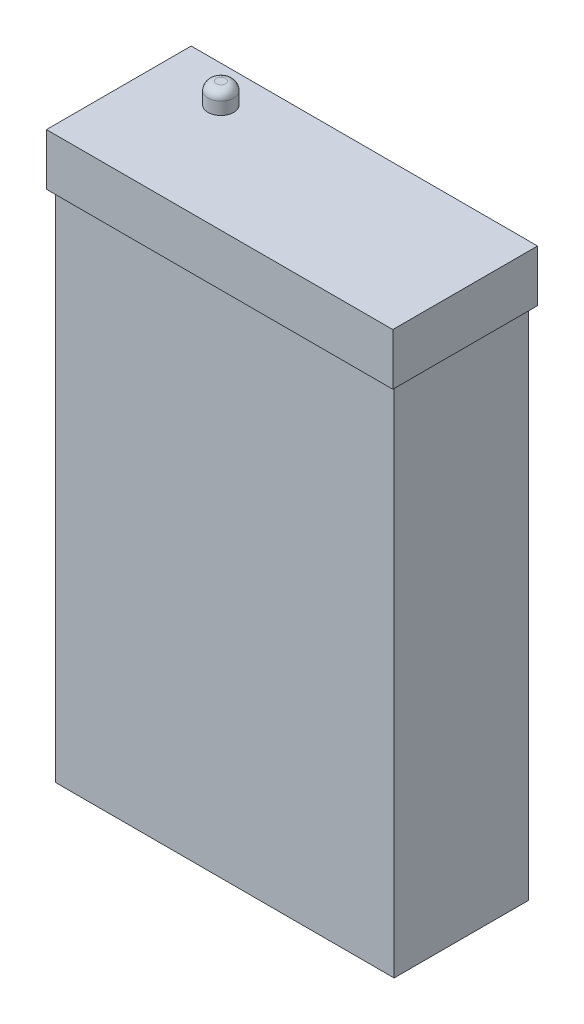
ISO-10303-21;
HEADER;
FILE_DESCRIPTION(('STEP AP214'),'2;1');
FILE_NAME('part.step','',(''),(''),'','','');
FILE_SCHEMA(('AUTOMOTIVE_DESIGN { 1 0 10303 214 1 1 1 1 }'));
ENDSEC;
DATA;
#1=APPLICATION_CONTEXT('core data for automotive mechanical design processes');
#2=APPLICATION_PROTOCOL_DEFINITION('international standard','automotive_design',2000,#1);
#3=PRODUCT_CONTEXT('',#1,'mechanical');
#4=PRODUCT('Part','Part','',(#3));
#5=PRODUCT_RELATED_PRODUCT_CATEGORY('part','',(#4));
#6=PRODUCT_DEFINITION_FORMATION('','',#4);
#7=PRODUCT_DEFINITION_CONTEXT('part definition',#1,'design');
#8=PRODUCT_DEFINITION('design','',#6,#7);
#9=PRODUCT_DEFINITION_SHAPE('','',#8);
#10=(LENGTH_UNIT() NAMED_UNIT(*) SI_UNIT(.MILLI.,.METRE.));
#11=(NAMED_UNIT(*) PLANE_ANGLE_UNIT() SI_UNIT($,.RADIAN.));
#12=(NAMED_UNIT(*) SI_UNIT($,.STERADIAN.) SOLID_ANGLE_UNIT());
#13=UNCERTAINTY_MEASURE_WITH_UNIT(LENGTH_MEASURE(1.E-05),#10,'distance_accuracy_value','');
#14=(GEOMETRIC_REPRESENTATION_CONTEXT(3) GLOBAL_UNCERTAINTY_ASSIGNED_CONTEXT((#13)) GLOBAL_UNIT_ASSIGNED_CONTEXT((#10,
#11,#12)) REPRESENTATION_CONTEXT('',''));
#15=CARTESIAN_POINT('',(0.,0.,0.));
#16=DIRECTION('',(0.,0.,1.));
#17=DIRECTION('',(1.,0.,0.));
#18=AXIS2_PLACEMENT_3D('',#15,#16,#17);
#19=CARTESIAN_POINT('',(0.,360.3625,0.));
#20=DIRECTION('',(0.,1.,0.));
#21=DIRECTION('',(0.,0.,1.));
#22=AXIS2_PLACEMENT_3D('',#19,#20,#21);
#23=PLANE('',#22);
#24=CARTESIAN_POINT('',(38.1,360.3625,19.05));
#25=DIRECTION('',(0.,-1.,0.));
#26=DIRECTION('',(1.,0.,-4.55119926386615E-09));
#27=AXIS2_PLACEMENT_3D('',#24,#25,#26);
#28=CIRCLE('',#27,2.85749999999999);
#29=CARTESIAN_POINT('',(40.9575,360.3625,19.049999994798));
#30=VERTEX_POINT('',#29);
#31=CARTESIAN_POINT('',(35.2425,360.3625,19.050000002601));
#32=VERTEX_POINT('',#31);
#33=EDGE_CURVE('E90',#30,#32,#28,.T.);
#34=ORIENTED_EDGE('',*,*,#33,.F.);
#35=CARTESIAN_POINT('',(38.1,360.3625,19.05));
#36=DIRECTION('',(0.,-1.,0.));
#37=DIRECTION('',(-1.,0.,0.));
#38=AXIS2_PLACEMENT_3D('',#35,#36,#37);
#39=CIRCLE('',#38,2.8575);
#40=EDGE_CURVE('E86',#32,#30,#39,.T.);
#41=ORIENTED_EDGE('',*,*,#40,.F.);
#42=EDGE_LOOP('',(#34,#41));
#43=FACE_BOUND('',#42,.T.);
#44=ADVANCED_FACE('F17',(#43),#23,.T.);
#45=CARTESIAN_POINT('',(35.2523067945625,355.2825,18.8134632001037));
#46=DIRECTION('',(-0.0827775327721082,0.,0.996568050896758));
#47=DIRECTION('',(-0.996568050896758,0.,-0.0827775327721081));
#48=AXIS2_PLACEMENT_3D('',#45,#46,#47);
#49=CIRCLE('',#48,5.08);
#50=TRIMMED_CURVE('',#49,(PARAMETER_VALUE(-2.16820274344025)),
(PARAMETER_VALUE(2.16820274344025)),.T.,.PARAMETER.);
#51=CARTESIAN_POINT('',(38.1,355.2825,19.05));
#52=DIRECTION('',(0.,1.,0.));
#53=AXIS1_PLACEMENT('',#51,#52);
#54=SURFACE_OF_REVOLUTION('',#50,#53);
#55=CARTESIAN_POINT('',(38.1,355.2825,19.05));
#56=DIRECTION('',(0.,1.,0.));
#57=DIRECTION('',(0.,0.,1.));
#58=AXIS2_PLACEMENT_3D('',#55,#56,#57);
#59=CIRCLE('',#58,7.9375);
#60=CARTESIAN_POINT('',(38.1,355.2825,26.9875));
#61=VERTEX_POINT('',#60);
#62=EDGE_CURVE('E96',#61,#61,#59,.F.);
#63=ORIENTED_EDGE('',*,*,#62,.F.);
#64=EDGE_LOOP('',(#63));
#65=FACE_BOUND('',#64,.T.);
#66=ORIENTED_EDGE('',*,*,#33,.T.);
#67=ORIENTED_EDGE('',*,*,#40,.T.);
#68=EDGE_LOOP('',(#66,#67));
#69=FACE_BOUND('',#68,.T.);
#70=ADVANCED_FACE('F95',(#65,#69),#54,.F.);
#71=CARTESIAN_POINT('',(38.1,347.6625,19.05));
#72=DIRECTION('',(0.,1.,0.));
#73=DIRECTION('',(0.,0.,1.));
#74=AXIS2_PLACEMENT_3D('',#71,#72,#73);
#75=CYLINDRICAL_SURFACE('',#74,7.9375);
#76=CARTESIAN_POINT('',(38.1,347.6625,19.05));
#77=DIRECTION('',(0.,1.,0.));
#78=DIRECTION('',(0.,0.,1.));
#79=AXIS2_PLACEMENT_3D('',#76,#77,#78);
#80=CIRCLE('',#79,7.9375);
#81=CARTESIAN_POINT('',(38.1,347.6625,26.9875));
#82=VERTEX_POINT('',#81);
#83=EDGE_CURVE('E103',#82,#82,#80,.F.);
#84=ORIENTED_EDGE('',*,*,#83,.F.);
#85=EDGE_LOOP('',(#84));
#86=FACE_BOUND('',#85,.T.);
#87=ORIENTED_EDGE('',*,*,#62,.T.);
#88=EDGE_LOOP('',(#87));
#89=FACE_BOUND('',#88,.T.);
#90=ADVANCED_FACE('F113',(#86,#89),#75,.T.);
#91=CARTESIAN_POINT('',(0.,347.6625,0.));
#92=DIRECTION('',(0.,1.,0.));
#93=DIRECTION('',(0.,0.,1.));
#94=AXIS2_PLACEMENT_3D('',#91,#92,#93);
#95=PLANE('',#94);
#96=ORIENTED_EDGE('',*,*,#83,.T.);
#97=EDGE_LOOP('',(#96));
#98=FACE_BOUND('',#97,.T.);
#99=DIRECTION('',(1.,0.,0.));
#100=VECTOR('',#99,1.);
#101=CARTESIAN_POINT('',(-2.38125,347.6625,85.725));
#102=LINE('',#101,#100);
#103=CARTESIAN_POINT('',(210.34375,347.6625,85.725));
#104=VERTEX_POINT('',#103);
#105=CARTESIAN_POINT('',(-2.38125,347.6625,85.725));
#106=VERTEX_POINT('',#105);
#107=EDGE_CURVE('E153',#104,#106,#102,.F.);
#108=ORIENTED_EDGE('',*,*,#107,.F.);
#109=DIRECTION('',(0.,0.,-1.));
#110=VECTOR('',#109,1.);
#111=CARTESIAN_POINT('',(210.34375,347.6625,85.725));
#112=LINE('',#111,#110);
#113=CARTESIAN_POINT('',(210.34375,347.6625,-3.175));
#114=VERTEX_POINT('',#113);
#115=EDGE_CURVE('E120',#114,#104,#112,.F.);
#116=ORIENTED_EDGE('',*,*,#115,.F.);
#117=DIRECTION('',(-1.,0.,0.));
#118=VECTOR('',#117,1.);
#119=CARTESIAN_POINT('',(210.34375,347.6625,-3.175));
#120=LINE('',#119,#118);
#121=CARTESIAN_POINT('',(-2.38125,347.6625,-3.175));
#122=VERTEX_POINT('',#121);
#123=EDGE_CURVE('E135',#122,#114,#120,.F.);
#124=ORIENTED_EDGE('',*,*,#123,.F.);
#125=DIRECTION('',(0.,0.,1.));
#126=VECTOR('',#125,1.);
#127=CARTESIAN_POINT('',(-2.38125,347.6625,-3.175));
#128=LINE('',#127,#126);
#129=EDGE_CURVE('E145',#106,#122,#128,.F.);
#130=ORIENTED_EDGE('',*,*,#129,.F.);
#131=EDGE_LOOP('',(#108,#116,#124,#130));
#132=FACE_BOUND('',#131,.T.);
#133=ADVANCED_FACE('F241',(#98,#132),#95,.T.);
#134=CARTESIAN_POINT('',(210.34375,315.9125,85.725));
#135=DIRECTION('',(1.,0.,0.));
#136=DIRECTION('',(0.,0.,-1.));
#137=AXIS2_PLACEMENT_3D('',#134,#135,#136);
#138=PLANE('',#137);
#139=DIRECTION('',(0.,1.,0.));
#140=VECTOR('',#139,1.);
#141=CARTESIAN_POINT('',(210.34375,315.9125,85.725));
#142=LINE('',#141,#140);
#143=CARTESIAN_POINT('',(210.34375,315.9125,85.725));
#144=VERTEX_POINT('',#143);
#145=EDGE_CURVE('E151',#144,#104,#142,.T.);
#146=ORIENTED_EDGE('',*,*,#145,.F.);
#147=DIRECTION('',(0.,0.,1.));
#148=VECTOR('',#147,1.);
#149=CARTESIAN_POINT('',(210.34375,315.9125,0.));
#150=LINE('',#149,#148);
#151=CARTESIAN_POINT('',(210.34375,315.9125,-3.175));
#152=VERTEX_POINT('',#151);
#153=EDGE_CURVE('E157',#144,#152,#150,.F.);
#154=ORIENTED_EDGE('',*,*,#153,.T.);
#155=DIRECTION('',(0.,1.,0.));
#156=VECTOR('',#155,1.);
#157=CARTESIAN_POINT('',(210.34375,315.9125,-3.175));
#158=LINE('',#157,#156);
#159=EDGE_CURVE('E141',#114,#152,#158,.F.);
#160=ORIENTED_EDGE('',*,*,#159,.F.);
#161=ORIENTED_EDGE('',*,*,#115,.T.);
#162=EDGE_LOOP('',(#146,#154,#160,#161));
#163=FACE_BOUND('',#162,.T.);
#164=ADVANCED_FACE('F239',(#163),#138,.T.);
#165=CARTESIAN_POINT('',(210.34375,315.9125,-3.175));
#166=DIRECTION('',(0.,0.,-1.));
#167=DIRECTION('',(-1.,0.,0.));
#168=AXIS2_PLACEMENT_3D('',#165,#166,#167);
#169=PLANE('',#168);
#170=ORIENTED_EDGE('',*,*,#159,.T.);
#171=DIRECTION('',(1.,0.,0.));
#172=VECTOR('',#171,1.);
#173=CARTESIAN_POINT('',(0.,315.9125,-3.175));
#174=LINE('',#173,#172);
#175=CARTESIAN_POINT('',(-2.38125,315.9125,-3.175));
#176=VERTEX_POINT('',#175);
#177=EDGE_CURVE('E160',#152,#176,#174,.F.);
#178=ORIENTED_EDGE('',*,*,#177,.T.);
#179=DIRECTION('',(0.,1.,0.));
#180=VECTOR('',#179,1.);
#181=CARTESIAN_POINT('',(-2.38125,315.9125,-3.175));
#182=LINE('',#181,#180);
#183=EDGE_CURVE('E149',#122,#176,#182,.F.);
#184=ORIENTED_EDGE('',*,*,#183,.F.);
#185=ORIENTED_EDGE('',*,*,#123,.T.);
#186=EDGE_LOOP('',(#170,#178,#184,#185));
#187=FACE_BOUND('',#186,.T.);
#188=ADVANCED_FACE('F235',(#187),#169,.T.);
#189=CARTESIAN_POINT('',(-2.38125,315.9125,-3.175));
#190=DIRECTION('',(-1.,0.,0.));
#191=DIRECTION('',(0.,0.,1.));
#192=AXIS2_PLACEMENT_3D('',#189,#190,#191);
#193=PLANE('',#192);
#194=ORIENTED_EDGE('',*,*,#183,.T.);
#195=DIRECTION('',(0.,0.,1.));
#196=VECTOR('',#195,1.);
#197=CARTESIAN_POINT('',(-2.38125,315.9125,0.));
#198=LINE('',#197,#196);
#199=CARTESIAN_POINT('',(-2.38125,315.9125,85.725));
#200=VERTEX_POINT('',#199);
#201=EDGE_CURVE('E163',#176,#200,#198,.T.);
#202=ORIENTED_EDGE('',*,*,#201,.T.);
#203=DIRECTION('',(0.,1.,0.));
#204=VECTOR('',#203,1.);
#205=CARTESIAN_POINT('',(-2.38125,315.9125,85.725));
#206=LINE('',#205,#204);
#207=EDGE_CURVE('E155',#106,#200,#206,.F.);
#208=ORIENTED_EDGE('',*,*,#207,.F.);
#209=ORIENTED_EDGE('',*,*,#129,.T.);
#210=EDGE_LOOP('',(#194,#202,#208,#209));
#211=FACE_BOUND('',#210,.T.);
#212=ADVANCED_FACE('F231',(#211),#193,.T.);
#213=CARTESIAN_POINT('',(-2.38125,315.9125,85.725));
#214=DIRECTION('',(0.,0.,1.));
#215=DIRECTION('',(1.,0.,0.));
#216=AXIS2_PLACEMENT_3D('',#213,#214,#215);
#217=PLANE('',#216);
#218=ORIENTED_EDGE('',*,*,#207,.T.);
#219=DIRECTION('',(1.,0.,0.));
#220=VECTOR('',#219,1.);
#221=CARTESIAN_POINT('',(0.,315.9125,85.725));
#222=LINE('',#221,#220);
#223=EDGE_CURVE('E166',#200,#144,#222,.T.);
#224=ORIENTED_EDGE('',*,*,#223,.T.);
#225=ORIENTED_EDGE('',*,*,#145,.T.);
#226=ORIENTED_EDGE('',*,*,#107,.T.);
#227=EDGE_LOOP('',(#218,#224,#225,#226));
#228=FACE_BOUND('',#227,.T.);
#229=ADVANCED_FACE('F227',(#228),#217,.T.);
#230=CARTESIAN_POINT('',(0.,0.,82.55));
#231=DIRECTION('',(0.,0.,1.));
#232=DIRECTION('',(1.,0.,0.));
#233=AXIS2_PLACEMENT_3D('',#230,#231,#232);
#234=PLANE('',#233);
#235=DIRECTION('',(0.,1.,0.));
#236=VECTOR('',#235,1.);
#237=CARTESIAN_POINT('',(207.9625,0.,82.55));
#238=LINE('',#237,#236);
#239=CARTESIAN_POINT('',(207.9625,315.9125,82.55));
#240=VERTEX_POINT('',#239);
#241=CARTESIAN_POINT('',(207.9625,0.,82.55));
#242=VERTEX_POINT('',#241);
#243=EDGE_CURVE('E180',#240,#242,#238,.F.);
#244=ORIENTED_EDGE('',*,*,#243,.F.);
#245=DIRECTION('',(1.,0.,0.));
#246=VECTOR('',#245,1.);
#247=CARTESIAN_POINT('',(0.,315.9125,82.55));
#248=LINE('',#247,#246);
#249=CARTESIAN_POINT('',(0.,315.9125,82.55));
#250=VERTEX_POINT('',#249);
#251=EDGE_CURVE('E169',#240,#250,#248,.F.);
#252=ORIENTED_EDGE('',*,*,#251,.T.);
#253=DIRECTION('',(0.,1.,0.));
#254=VECTOR('',#253,1.);
#255=CARTESIAN_POINT('',(0.,315.9125,82.55));
#256=LINE('',#255,#254);
#257=CARTESIAN_POINT('',(0.,0.,82.55));
#258=VERTEX_POINT('',#257);
#259=EDGE_CURVE('E172',#258,#250,#256,.T.);
#260=ORIENTED_EDGE('',*,*,#259,.F.);
#261=DIRECTION('',(1.,0.,0.));
#262=VECTOR('',#261,1.);
#263=CARTESIAN_POINT('',(0.,0.,82.55));
#264=LINE('',#263,#262);
#265=EDGE_CURVE('E176',#242,#258,#264,.F.);
#266=ORIENTED_EDGE('',*,*,#265,.F.);
#267=EDGE_LOOP('',(#244,#252,#260,#266));
#268=FACE_BOUND('',#267,.T.);
#269=ADVANCED_FACE('F224',(#268),#234,.T.);
#270=CARTESIAN_POINT('',(0.,315.9125,0.));
#271=DIRECTION('',(0.,1.,0.));
#272=DIRECTION('',(0.,0.,1.));
#273=AXIS2_PLACEMENT_3D('',#270,#271,#272);
#274=PLANE('',#273);
#275=ORIENTED_EDGE('',*,*,#251,.F.);
#276=DIRECTION('',(0.,0.,-1.));
#277=VECTOR('',#276,1.);
#278=CARTESIAN_POINT('',(207.9625,315.9125,0.));
#279=LINE('',#278,#277);
#280=CARTESIAN_POINT('',(207.9625,315.9125,0.));
#281=VERTEX_POINT('',#280);
#282=EDGE_CURVE('E183',#281,#240,#279,.F.);
#283=ORIENTED_EDGE('',*,*,#282,.F.);
#284=DIRECTION('',(1.,0.,0.));
#285=VECTOR('',#284,1.);
#286=CARTESIAN_POINT('',(0.,315.9125,0.));
#287=LINE('',#286,#285);
#288=CARTESIAN_POINT('',(0.,315.9125,0.));
#289=VERTEX_POINT('',#288);
#290=EDGE_CURVE('E186',#281,#289,#287,.F.);
#291=ORIENTED_EDGE('',*,*,#290,.T.);
#292=DIRECTION('',(0.,0.,1.));
#293=VECTOR('',#292,1.);
#294=CARTESIAN_POINT('',(0.,315.9125,0.));
#295=LINE('',#294,#293);
#296=EDGE_CURVE('E174',#250,#289,#295,.F.);
#297=ORIENTED_EDGE('',*,*,#296,.F.);
#298=EDGE_LOOP('',(#275,#283,#291,#297));
#299=FACE_BOUND('',#298,.T.);
#300=ORIENTED_EDGE('',*,*,#201,.F.);
#301=ORIENTED_EDGE('',*,*,#177,.F.);
#302=ORIENTED_EDGE('',*,*,#153,.F.);
#303=ORIENTED_EDGE('',*,*,#223,.F.);
#304=EDGE_LOOP('',(#300,#301,#302,#303));
#305=FACE_BOUND('',#304,.T.);
#306=ADVANCED_FACE('F205',(#299,#305),#274,.F.);
#307=CARTESIAN_POINT('',(0.,315.9125,0.));
#308=DIRECTION('',(-1.,0.,0.));
#309=DIRECTION('',(0.,0.,1.));
#310=AXIS2_PLACEMENT_3D('',#307,#308,#309);
#311=PLANE('',#310);
#312=ORIENTED_EDGE('',*,*,#259,.T.);
#313=ORIENTED_EDGE('',*,*,#296,.T.);
#314=DIRECTION('',(0.,1.,0.));
#315=VECTOR('',#314,1.);
#316=CARTESIAN_POINT('',(0.,0.,0.));
#317=LINE('',#316,#315);
#318=CARTESIAN_POINT('',(0.,0.,0.));
#319=VERTEX_POINT('',#318);
#320=EDGE_CURVE('E189',#289,#319,#317,.F.);
#321=ORIENTED_EDGE('',*,*,#320,.T.);
#322=DIRECTION('',(0.,0.,-1.));
#323=VECTOR('',#322,1.);
#324=CARTESIAN_POINT('',(0.,0.,0.));
#325=LINE('',#324,#323);
#326=EDGE_CURVE('E178',#258,#319,#325,.T.);
#327=ORIENTED_EDGE('',*,*,#326,.F.);
#328=EDGE_LOOP('',(#312,#313,#321,#327));
#329=FACE_BOUND('',#328,.T.);
#330=ADVANCED_FACE('F201',(#329),#311,.T.);
#331=CARTESIAN_POINT('',(0.,0.,0.));
#332=DIRECTION('',(0.,-1.,0.));
#333=DIRECTION('',(0.,0.,-1.));
#334=AXIS2_PLACEMENT_3D('',#331,#332,#333);
#335=PLANE('',#334);
#336=ORIENTED_EDGE('',*,*,#326,.T.);
#337=DIRECTION('',(1.,0.,0.));
#338=VECTOR('',#337,1.);
#339=CARTESIAN_POINT('',(0.,0.,0.));
#340=LINE('',#339,#338);
#341=CARTESIAN_POINT('',(207.9625,0.,0.));
#342=VERTEX_POINT('',#341);
#343=EDGE_CURVE('E28',#319,#342,#340,.T.);
#344=ORIENTED_EDGE('',*,*,#343,.T.);
#345=DIRECTION('',(0.,0.,-1.));
#346=VECTOR('',#345,1.);
#347=CARTESIAN_POINT('',(207.9625,0.,0.));
#348=LINE('',#347,#346);
#349=EDGE_CURVE('E36',#242,#342,#348,.T.);
#350=ORIENTED_EDGE('',*,*,#349,.F.);
#351=ORIENTED_EDGE('',*,*,#265,.T.);
#352=EDGE_LOOP('',(#336,#344,#350,#351));
#353=FACE_BOUND('',#352,.T.);
#354=ADVANCED_FACE('F195',(#353),#335,.T.);
#355=CARTESIAN_POINT('',(207.9625,0.,0.));
#356=DIRECTION('',(1.,0.,0.));
#357=DIRECTION('',(0.,0.,-1.));
#358=AXIS2_PLACEMENT_3D('',#355,#356,#357);
#359=PLANE('',#358);
#360=DIRECTION('',(0.,1.,0.));
#361=VECTOR('',#360,1.);
#362=CARTESIAN_POINT('',(207.9625,0.,0.));
#363=LINE('',#362,#361);
#364=EDGE_CURVE('E11',#342,#281,#363,.T.);
#365=ORIENTED_EDGE('',*,*,#364,.T.);
#366=ORIENTED_EDGE('',*,*,#282,.T.);
#367=ORIENTED_EDGE('',*,*,#243,.T.);
#368=ORIENTED_EDGE('',*,*,#349,.T.);
#369=EDGE_LOOP('',(#365,#366,#367,#368));
#370=FACE_BOUND('',#369,.T.);
#371=ADVANCED_FACE('F209',(#370),#359,.T.);
#372=CARTESIAN_POINT('',(0.,0.,0.));
#373=DIRECTION('',(0.,0.,1.));
#374=DIRECTION('',(1.,0.,0.));
#375=AXIS2_PLACEMENT_3D('',#372,#373,#374);
#376=PLANE('',#375);
#377=ORIENTED_EDGE('',*,*,#343,.F.);
#378=ORIENTED_EDGE('',*,*,#320,.F.);
#379=ORIENTED_EDGE('',*,*,#290,.F.);
#380=ORIENTED_EDGE('',*,*,#364,.F.);
#381=EDGE_LOOP('',(#377,#378,#379,#380));
#382=FACE_BOUND('',#381,.T.);
#383=ADVANCED_FACE('F199',(#382),#376,.F.);
#384=CLOSED_SHELL('',(#44,#70,#90,#133,#164,#188,#212,#229,#269,#306,#330,#354,#371,#383));
#385=MANIFOLD_SOLID_BREP('B1',#384);
#386=ADVANCED_BREP_SHAPE_REPRESENTATION('',(#18,#385),#14);
#387=SHAPE_DEFINITION_REPRESENTATION(#9,#386);
ENDSEC;
END-ISO-10303-21;
